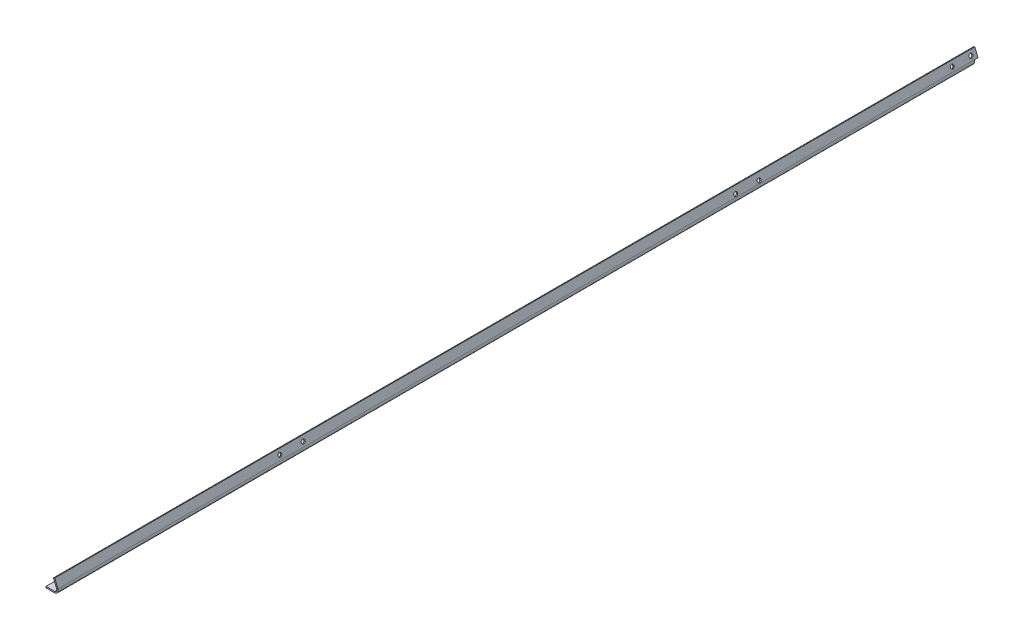
ISO-10303-21;
HEADER;
FILE_DESCRIPTION(('STEP AP214'),'2;1');
FILE_NAME('part.step','',(''),(''),'','','');
FILE_SCHEMA(('AUTOMOTIVE_DESIGN { 1 0 10303 214 1 1 1 1 }'));
ENDSEC;
DATA;
#1=APPLICATION_CONTEXT('core data for automotive mechanical design processes');
#2=APPLICATION_PROTOCOL_DEFINITION('international standard','automotive_design',2000,#1);
#3=PRODUCT_CONTEXT('',#1,'mechanical');
#4=PRODUCT('Part','Part','',(#3));
#5=PRODUCT_RELATED_PRODUCT_CATEGORY('part','',(#4));
#6=PRODUCT_DEFINITION_FORMATION('','',#4);
#7=PRODUCT_DEFINITION_CONTEXT('part definition',#1,'design');
#8=PRODUCT_DEFINITION('design','',#6,#7);
#9=PRODUCT_DEFINITION_SHAPE('','',#8);
#10=(LENGTH_UNIT() NAMED_UNIT(*) SI_UNIT(.MILLI.,.METRE.));
#11=(NAMED_UNIT(*) PLANE_ANGLE_UNIT() SI_UNIT($,.RADIAN.));
#12=(NAMED_UNIT(*) SI_UNIT($,.STERADIAN.) SOLID_ANGLE_UNIT());
#13=UNCERTAINTY_MEASURE_WITH_UNIT(LENGTH_MEASURE(1.E-05),#10,'distance_accuracy_value','');
#14=(GEOMETRIC_REPRESENTATION_CONTEXT(3) GLOBAL_UNCERTAINTY_ASSIGNED_CONTEXT((#13)) GLOBAL_UNIT_ASSIGNED_CONTEXT((#10,
#11,#12)) REPRESENTATION_CONTEXT('',''));
#15=CARTESIAN_POINT('',(0.,0.,0.));
#16=DIRECTION('',(0.,0.,1.));
#17=DIRECTION('',(1.,0.,0.));
#18=AXIS2_PLACEMENT_3D('',#15,#16,#17);
#19=CARTESIAN_POINT('',(-11.8604877481019,8.,-985.));
#20=DIRECTION('',(0.,0.,1.));
#21=DIRECTION('',(-1.,0.,0.));
#22=AXIS2_PLACEMENT_3D('',#19,#20,#21);
#23=CYLINDRICAL_SURFACE('',#22,5.);
#24=DIRECTION('',(0.,0.,1.));
#25=VECTOR('',#24,1.);
#26=CARTESIAN_POINT('',(-11.8604877481019,3.,-985.));
#27=LINE('',#26,#25);
#28=CARTESIAN_POINT('',(-11.8604877481019,3.,-977.));
#29=VERTEX_POINT('',#28);
#30=CARTESIAN_POINT('',(-11.8604877481019,3.,985.));
#31=VERTEX_POINT('',#30);
#32=EDGE_CURVE('E185',#29,#31,#27,.T.);
#33=ORIENTED_EDGE('',*,*,#32,.T.);
#34=CARTESIAN_POINT('',(-11.8604877481019,8.,985.));
#35=DIRECTION('',(0.,0.,1.));
#36=DIRECTION('',(1.,0.,0.));
#37=AXIS2_PLACEMENT_3D('',#34,#35,#36);
#38=CIRCLE('',#37,5.);
#39=CARTESIAN_POINT('',(-7.22456847526795,9.87303296707955,985.));
#40=VERTEX_POINT('',#39);
#41=EDGE_CURVE('E169',#31,#40,#38,.T.);
#42=ORIENTED_EDGE('',*,*,#41,.T.);
#43=DIRECTION('',(0.,0.,1.));
#44=VECTOR('',#43,1.);
#45=CARTESIAN_POINT('',(-7.22456847526795,9.87303296707955,-985.));
#46=LINE('',#45,#44);
#47=CARTESIAN_POINT('',(-7.22456847526795,9.87303296707955,-977.));
#48=VERTEX_POINT('',#47);
#49=EDGE_CURVE('E188',#48,#40,#46,.T.);
#50=ORIENTED_EDGE('',*,*,#49,.F.);
#51=CARTESIAN_POINT('',(-11.8604877481019,8.,-977.));
#52=DIRECTION('',(0.,0.,-1.));
#53=DIRECTION('',(-1.,0.,0.));
#54=AXIS2_PLACEMENT_3D('',#51,#52,#53);
#55=CIRCLE('',#54,5.);
#56=EDGE_CURVE('E136',#48,#29,#55,.T.);
#57=ORIENTED_EDGE('',*,*,#56,.T.);
#58=EDGE_LOOP('',(#33,#42,#50,#57));
#59=FACE_BOUND('',#58,.T.);
#60=ADVANCED_FACE('F37',(#59),#23,.F.);
#61=CARTESIAN_POINT('',(0.,3.,-985.));
#62=DIRECTION('',(0.,1.,0.));
#63=DIRECTION('',(-1.,0.,0.));
#64=AXIS2_PLACEMENT_3D('',#61,#62,#63);
#65=PLANE('',#64);
#66=DIRECTION('',(0.,0.,1.));
#67=VECTOR('',#66,1.);
#68=CARTESIAN_POINT('',(-30.,3.,-985.));
#69=LINE('',#68,#67);
#70=CARTESIAN_POINT('',(-30.,3.,-977.));
#71=VERTEX_POINT('',#70);
#72=CARTESIAN_POINT('',(-30.,3.,985.));
#73=VERTEX_POINT('',#72);
#74=EDGE_CURVE('E182',#71,#73,#69,.T.);
#75=ORIENTED_EDGE('',*,*,#74,.T.);
#76=DIRECTION('',(1.,0.,0.));
#77=VECTOR('',#76,1.);
#78=CARTESIAN_POINT('',(0.,3.,985.));
#79=LINE('',#78,#77);
#80=EDGE_CURVE('E172',#73,#31,#79,.T.);
#81=ORIENTED_EDGE('',*,*,#80,.T.);
#82=ORIENTED_EDGE('',*,*,#32,.F.);
#83=DIRECTION('',(-1.,0.,0.));
#84=VECTOR('',#83,1.);
#85=CARTESIAN_POINT('',(0.,3.,-977.));
#86=LINE('',#85,#84);
#87=EDGE_CURVE('E123',#29,#71,#86,.T.);
#88=ORIENTED_EDGE('',*,*,#87,.T.);
#89=EDGE_LOOP('',(#75,#81,#82,#88));
#90=FACE_BOUND('',#89,.T.);
#91=ADVANCED_FACE('F208',(#90),#65,.T.);
#92=CARTESIAN_POINT('',(-30.,0.,-985.));
#93=DIRECTION('',(-1.,0.,0.));
#94=DIRECTION('',(0.,0.,-1.));
#95=AXIS2_PLACEMENT_3D('',#92,#93,#94);
#96=PLANE('',#95);
#97=DIRECTION('',(0.,0.,1.));
#98=VECTOR('',#97,1.);
#99=CARTESIAN_POINT('',(-30.,0.,-985.));
#100=LINE('',#99,#98);
#101=CARTESIAN_POINT('',(-30.,0.,-977.));
#102=VERTEX_POINT('',#101);
#103=CARTESIAN_POINT('',(-30.,0.,985.));
#104=VERTEX_POINT('',#103);
#105=EDGE_CURVE('E144',#102,#104,#100,.T.);
#106=ORIENTED_EDGE('',*,*,#105,.T.);
#107=DIRECTION('',(0.,1.,0.));
#108=VECTOR('',#107,1.);
#109=CARTESIAN_POINT('',(-30.,0.,985.));
#110=LINE('',#109,#108);
#111=EDGE_CURVE('E175',#104,#73,#110,.T.);
#112=ORIENTED_EDGE('',*,*,#111,.T.);
#113=ORIENTED_EDGE('',*,*,#74,.F.);
#114=DIRECTION('',(0.,-1.,0.));
#115=VECTOR('',#114,1.);
#116=CARTESIAN_POINT('',(-30.,0.,-977.));
#117=LINE('',#116,#115);
#118=EDGE_CURVE('E127',#102,#71,#117,.F.);
#119=ORIENTED_EDGE('',*,*,#118,.F.);
#120=EDGE_LOOP('',(#106,#112,#113,#119));
#121=FACE_BOUND('',#120,.T.);
#122=ADVANCED_FACE('F215',(#121),#96,.T.);
#123=CARTESIAN_POINT('',(0.,0.,-985.));
#124=DIRECTION('',(0.,1.,0.));
#125=DIRECTION('',(-1.,0.,0.));
#126=AXIS2_PLACEMENT_3D('',#123,#124,#125);
#127=PLANE('',#126);
#128=DIRECTION('',(-1.,0.,0.));
#129=VECTOR('',#128,1.);
#130=CARTESIAN_POINT('',(-3.86048774810189,0.,-977.));
#131=LINE('',#130,#129);
#132=CARTESIAN_POINT('',(-11.8604877481019,0.,-977.));
#133=VERTEX_POINT('',#132);
#134=EDGE_CURVE('E120',#133,#102,#131,.T.);
#135=ORIENTED_EDGE('',*,*,#134,.F.);
#136=DIRECTION('',(0.,0.,1.));
#137=VECTOR('',#136,1.);
#138=CARTESIAN_POINT('',(-11.8604877481019,0.,-985.));
#139=LINE('',#138,#137);
#140=CARTESIAN_POINT('',(-11.8604877481019,0.,985.));
#141=VERTEX_POINT('',#140);
#142=EDGE_CURVE('E139',#133,#141,#139,.T.);
#143=ORIENTED_EDGE('',*,*,#142,.T.);
#144=DIRECTION('',(1.,0.,0.));
#145=VECTOR('',#144,1.);
#146=CARTESIAN_POINT('',(0.,0.,985.));
#147=LINE('',#146,#145);
#148=EDGE_CURVE('E177',#104,#141,#147,.T.);
#149=ORIENTED_EDGE('',*,*,#148,.F.);
#150=ORIENTED_EDGE('',*,*,#105,.F.);
#151=EDGE_LOOP('',(#135,#143,#149,#150));
#152=FACE_BOUND('',#151,.T.);
#153=ADVANCED_FACE('F148',(#152),#127,.F.);
#154=CARTESIAN_POINT('',(-11.8604877481019,8.,-985.));
#155=DIRECTION('',(0.,0.,1.));
#156=DIRECTION('',(-1.,0.,0.));
#157=AXIS2_PLACEMENT_3D('',#154,#155,#156);
#158=CYLINDRICAL_SURFACE('',#157,8.);
#159=CARTESIAN_POINT('',(-11.8604877481019,8.,-977.));
#160=DIRECTION('',(0.,0.,-1.));
#161=DIRECTION('',(-1.,0.,0.));
#162=AXIS2_PLACEMENT_3D('',#159,#160,#161);
#163=CIRCLE('',#162,8.);
#164=CARTESIAN_POINT('',(-4.44301691156759,10.9968527473273,-977.));
#165=VERTEX_POINT('',#164);
#166=EDGE_CURVE('E130',#165,#133,#163,.T.);
#167=ORIENTED_EDGE('',*,*,#166,.F.);
#168=DIRECTION('',(0.,0.,1.));
#169=VECTOR('',#168,1.);
#170=CARTESIAN_POINT('',(-4.44301691156759,10.9968527473273,-985.));
#171=LINE('',#170,#169);
#172=CARTESIAN_POINT('',(-4.44301691156759,10.9968527473273,985.));
#173=VERTEX_POINT('',#172);
#174=EDGE_CURVE('E161',#165,#173,#171,.T.);
#175=ORIENTED_EDGE('',*,*,#174,.T.);
#176=CARTESIAN_POINT('',(-11.8604877481019,8.,985.));
#177=DIRECTION('',(0.,0.,-1.));
#178=DIRECTION('',(-1.,0.,0.));
#179=AXIS2_PLACEMENT_3D('',#176,#177,#178);
#180=CIRCLE('',#179,8.);
#181=EDGE_CURVE('E141',#141,#173,#180,.F.);
#182=ORIENTED_EDGE('',*,*,#181,.F.);
#183=ORIENTED_EDGE('',*,*,#142,.F.);
#184=EDGE_LOOP('',(#167,#175,#182,#183));
#185=FACE_BOUND('',#184,.T.);
#186=ADVANCED_FACE('F140',(#185),#158,.T.);
#187=CARTESIAN_POINT('',(-4.44301691156759,10.9968527473273,985.));
#188=DIRECTION('',(0.,0.,1.));
#189=DIRECTION('',(-1.,0.,0.));
#190=AXIS2_PLACEMENT_3D('',#187,#188,#189);
#191=PLANE('',#190);
#192=DIRECTION('',(-0.927183854566789,-0.374606593415909,0.));
#193=VECTOR('',#192,1.);
#194=CARTESIAN_POINT('',(-4.44301691156759,10.9968527473273,985.));
#195=LINE('',#194,#193);
#196=EDGE_CURVE('E46',#173,#40,#195,.T.);
#197=ORIENTED_EDGE('',*,*,#196,.T.);
#198=ORIENTED_EDGE('',*,*,#41,.F.);
#199=DIRECTION('',(0.,-1.,0.));
#200=VECTOR('',#199,1.);
#201=CARTESIAN_POINT('',(-11.8604877481019,3.,985.));
#202=LINE('',#201,#200);
#203=EDGE_CURVE('E82',#31,#141,#202,.T.);
#204=ORIENTED_EDGE('',*,*,#203,.T.);
#205=ORIENTED_EDGE('',*,*,#181,.T.);
#206=EDGE_LOOP('',(#197,#198,#204,#205));
#207=FACE_BOUND('',#206,.T.);
#208=ADVANCED_FACE('F39',(#207),#191,.T.);
#209=CARTESIAN_POINT('',(-11.8604877481019,3.,985.));
#210=DIRECTION('',(0.,0.,1.));
#211=DIRECTION('',(-1.,0.,0.));
#212=AXIS2_PLACEMENT_3D('',#209,#210,#211);
#213=PLANE('',#212);
#214=DIRECTION('',(-0.37460659341591,0.927183854566788,0.));
#215=VECTOR('',#214,1.);
#216=CARTESIAN_POINT('',(0.,0.,985.));
#217=LINE('',#216,#215);
#218=CARTESIAN_POINT('',(-11.2381978024773,27.8155156370036,985.));
#219=VERTEX_POINT('',#218);
#220=EDGE_CURVE('E88',#173,#219,#217,.T.);
#221=ORIENTED_EDGE('',*,*,#220,.T.);
#222=DIRECTION('',(0.927183854566789,0.374606593415908,0.));
#223=VECTOR('',#222,1.);
#224=CARTESIAN_POINT('',(-14.0197493661777,26.6916958567559,985.));
#225=LINE('',#224,#223);
#226=CARTESIAN_POINT('',(-14.0197493661777,26.6916958567559,985.));
#227=VERTEX_POINT('',#226);
#228=EDGE_CURVE('E163',#227,#219,#225,.T.);
#229=ORIENTED_EDGE('',*,*,#228,.F.);
#230=DIRECTION('',(-0.37460659341591,0.927183854566788,0.));
#231=VECTOR('',#230,1.);
#232=CARTESIAN_POINT('',(-2.78155156370036,-1.12381978024773,985.));
#233=LINE('',#232,#231);
#234=EDGE_CURVE('E166',#40,#227,#233,.T.);
#235=ORIENTED_EDGE('',*,*,#234,.F.);
#236=ORIENTED_EDGE('',*,*,#196,.F.);
#237=EDGE_LOOP('',(#221,#229,#235,#236));
#238=FACE_BOUND('',#237,.T.);
#239=ADVANCED_FACE('F239',(#238),#213,.T.);
#240=CARTESIAN_POINT('',(0.,0.,-985.));
#241=DIRECTION('',(-0.927183854566788,-0.37460659341591,0.));
#242=DIRECTION('',(0.37460659341591,-0.927183854566788,0.));
#243=AXIS2_PLACEMENT_3D('',#240,#241,#242);
#244=PLANE('',#243);
#245=CARTESIAN_POINT('',(-6.36831208807047,15.7621255276354,-468.154266118861));
#246=DIRECTION('',(0.927183854566788,0.37460659341591,0.));
#247=DIRECTION('',(0.37460659341591,-0.927183854566788,0.));
#248=AXIS2_PLACEMENT_3D('',#245,#246,#247);
#249=CIRCLE('',#248,3.99999999999713);
#250=CARTESIAN_POINT('',(-4.86988571440791,12.0533901093709,-468.154266118861));
#251=VERTEX_POINT('',#250);
#252=EDGE_CURVE('E399',#251,#251,#249,.T.);
#253=ORIENTED_EDGE('',*,*,#252,.F.);
#254=EDGE_LOOP('',(#253));
#255=FACE_BOUND('',#254,.T.);
#256=CARTESIAN_POINT('',(-7.61410676221657,18.8455755476705,506.845733881157));
#257=DIRECTION('',(0.927183854566788,0.37460659341591,0.));
#258=DIRECTION('',(0.37460659341591,-0.927183854566788,0.));
#259=AXIS2_PLACEMENT_3D('',#256,#257,#258);
#260=CIRCLE('',#259,3.99999999999999);
#261=CARTESIAN_POINT('',(-6.11568038855293,15.1368401294033,506.845733881157));
#262=VERTEX_POINT('',#261);
#263=EDGE_CURVE('E403',#262,#262,#260,.T.);
#264=ORIENTED_EDGE('',*,*,#263,.F.);
#265=EDGE_LOOP('',(#264));
#266=FACE_BOUND('',#265,.T.);
#267=CARTESIAN_POINT('',(-7.61410676221657,18.8455755476705,456.845733881157));
#268=DIRECTION('',(0.927183854566788,0.37460659341591,0.));
#269=DIRECTION('',(0.37460659341591,-0.927183854566788,0.));
#270=AXIS2_PLACEMENT_3D('',#267,#268,#269);
#271=CIRCLE('',#270,3.99999999999999);
#272=CARTESIAN_POINT('',(-6.11568038855293,15.1368401294033,456.845733881157));
#273=VERTEX_POINT('',#272);
#274=EDGE_CURVE('E412',#273,#273,#271,.T.);
#275=ORIENTED_EDGE('',*,*,#274,.F.);
#276=EDGE_LOOP('',(#275));
#277=FACE_BOUND('',#276,.T.);
#278=CARTESIAN_POINT('',(-6.36831208807046,15.7621255276354,-518.154266118861));
#279=DIRECTION('',(0.927183854566788,0.37460659341591,0.));
#280=DIRECTION('',(0.37460659341591,-0.927183854566788,0.));
#281=AXIS2_PLACEMENT_3D('',#278,#279,#280);
#282=CIRCLE('',#281,3.99999999999713);
#283=CARTESIAN_POINT('',(-4.8698857144079,12.0533901093709,-518.154266118861));
#284=VERTEX_POINT('',#283);
#285=EDGE_CURVE('E418',#284,#284,#282,.T.);
#286=ORIENTED_EDGE('',*,*,#285,.F.);
#287=EDGE_LOOP('',(#286));
#288=FACE_BOUND('',#287,.T.);
#289=CARTESIAN_POINT('',(-7.61410676221543,18.8455755476677,-933.000000000009));
#290=DIRECTION('',(0.927183854566788,0.37460659341591,0.));
#291=DIRECTION('',(0.37460659341591,-0.927183854566788,0.));
#292=AXIS2_PLACEMENT_3D('',#289,#290,#291);
#293=CIRCLE('',#292,3.99999999999988);
#294=CARTESIAN_POINT('',(-6.11568038855184,15.1368401294006,-933.000000000009));
#295=VERTEX_POINT('',#294);
#296=EDGE_CURVE('E424',#295,#295,#293,.T.);
#297=ORIENTED_EDGE('',*,*,#296,.F.);
#298=EDGE_LOOP('',(#297));
#299=FACE_BOUND('',#298,.T.);
#300=CARTESIAN_POINT('',(-7.61410676221543,18.8455755476677,-973.000000000009));
#301=DIRECTION('',(0.927183854566788,0.37460659341591,0.));
#302=DIRECTION('',(0.37460659341591,-0.927183854566788,0.));
#303=AXIS2_PLACEMENT_3D('',#300,#301,#302);
#304=CIRCLE('',#303,4.0000000000051);
#305=CARTESIAN_POINT('',(-6.11568038854988,15.1368401293958,-973.000000000009));
#306=VERTEX_POINT('',#305);
#307=EDGE_CURVE('E430',#306,#306,#304,.T.);
#308=ORIENTED_EDGE('',*,*,#307,.F.);
#309=EDGE_LOOP('',(#308));
#310=FACE_BOUND('',#309,.T.);
#311=ORIENTED_EDGE('',*,*,#220,.F.);
#312=ORIENTED_EDGE('',*,*,#174,.F.);
#313=CARTESIAN_POINT('',(-4.44301691156759,10.9968527473273,-985.));
#314=VERTEX_POINT('',#313);
#315=EDGE_CURVE('E145',#314,#165,#171,.T.);
#316=ORIENTED_EDGE('',*,*,#315,.F.);
#317=DIRECTION('',(-0.37460659341591,0.927183854566788,0.));
#318=VECTOR('',#317,1.);
#319=CARTESIAN_POINT('',(0.,0.,-985.));
#320=LINE('',#319,#318);
#321=CARTESIAN_POINT('',(-11.2381978024773,27.8155156370036,-985.));
#322=VERTEX_POINT('',#321);
#323=EDGE_CURVE('E155',#314,#322,#320,.T.);
#324=ORIENTED_EDGE('',*,*,#323,.T.);
#325=DIRECTION('',(0.,0.,1.));
#326=VECTOR('',#325,1.);
#327=CARTESIAN_POINT('',(-11.2381978024773,27.8155156370036,-985.));
#328=LINE('',#327,#326);
#329=EDGE_CURVE('E194',#322,#219,#328,.T.);
#330=ORIENTED_EDGE('',*,*,#329,.T.);
#331=EDGE_LOOP('',(#311,#312,#316,#324,#330));
#332=FACE_BOUND('',#331,.T.);
#333=ADVANCED_FACE('F236',(#255,#266,#277,#288,#299,#310,#332),#244,.F.);
#334=CARTESIAN_POINT('',(-14.0197493661777,26.6916958567559,-985.));
#335=DIRECTION('',(-0.374606593415908,0.927183854566789,0.));
#336=DIRECTION('',(-0.927183854566789,-0.374606593415908,0.));
#337=AXIS2_PLACEMENT_3D('',#334,#335,#336);
#338=PLANE('',#337);
#339=ORIENTED_EDGE('',*,*,#228,.T.);
#340=ORIENTED_EDGE('',*,*,#329,.F.);
#341=DIRECTION('',(0.927183854566789,0.374606593415908,0.));
#342=VECTOR('',#341,1.);
#343=CARTESIAN_POINT('',(-14.0197493661777,26.6916958567559,-985.));
#344=LINE('',#343,#342);
#345=CARTESIAN_POINT('',(-14.0197493661777,26.6916958567559,-985.));
#346=VERTEX_POINT('',#345);
#347=EDGE_CURVE('E93',#346,#322,#344,.T.);
#348=ORIENTED_EDGE('',*,*,#347,.F.);
#349=DIRECTION('',(0.,0.,1.));
#350=VECTOR('',#349,1.);
#351=CARTESIAN_POINT('',(-14.0197493661777,26.6916958567559,-985.));
#352=LINE('',#351,#350);
#353=EDGE_CURVE('E192',#346,#227,#352,.T.);
#354=ORIENTED_EDGE('',*,*,#353,.T.);
#355=EDGE_LOOP('',(#339,#340,#348,#354));
#356=FACE_BOUND('',#355,.T.);
#357=ADVANCED_FACE('F232',(#356),#338,.T.);
#358=CARTESIAN_POINT('',(-2.78155156370036,-1.12381978024773,-985.));
#359=DIRECTION('',(-0.927183854566788,-0.37460659341591,0.));
#360=DIRECTION('',(0.37460659341591,-0.927183854566788,0.));
#361=AXIS2_PLACEMENT_3D('',#358,#359,#360);
#362=PLANE('',#361);
#363=CARTESIAN_POINT('',(-9.14986365177084,14.6383057473877,-468.154266118861));
#364=DIRECTION('',(0.927183854566788,0.37460659341591,0.));
#365=DIRECTION('',(0.37460659341591,-0.927183854566788,0.));
#366=AXIS2_PLACEMENT_3D('',#363,#364,#365);
#367=CIRCLE('',#366,3.99999999999713);
#368=CARTESIAN_POINT('',(-7.65143727810828,10.9295703291232,-468.154266118861));
#369=VERTEX_POINT('',#368);
#370=EDGE_CURVE('E396',#369,#369,#367,.T.);
#371=ORIENTED_EDGE('',*,*,#370,.T.);
#372=EDGE_LOOP('',(#371));
#373=FACE_BOUND('',#372,.T.);
#374=CARTESIAN_POINT('',(-10.3956583259169,17.7217557674227,506.845733881157));
#375=DIRECTION('',(0.927183854566788,0.37460659341591,0.));
#376=DIRECTION('',(0.37460659341591,-0.927183854566788,0.));
#377=AXIS2_PLACEMENT_3D('',#374,#375,#376);
#378=CIRCLE('',#377,3.99999999999999);
#379=CARTESIAN_POINT('',(-8.8972319522533,14.0130203491556,506.845733881157));
#380=VERTEX_POINT('',#379);
#381=EDGE_CURVE('E400',#380,#380,#378,.T.);
#382=ORIENTED_EDGE('',*,*,#381,.T.);
#383=EDGE_LOOP('',(#382));
#384=FACE_BOUND('',#383,.T.);
#385=CARTESIAN_POINT('',(-10.3956583259169,17.7217557674227,456.845733881157));
#386=DIRECTION('',(0.927183854566788,0.37460659341591,0.));
#387=DIRECTION('',(0.37460659341591,-0.927183854566788,0.));
#388=AXIS2_PLACEMENT_3D('',#385,#386,#387);
#389=CIRCLE('',#388,3.99999999999999);
#390=CARTESIAN_POINT('',(-8.8972319522533,14.0130203491556,456.845733881157));
#391=VERTEX_POINT('',#390);
#392=EDGE_CURVE('E409',#391,#391,#389,.T.);
#393=ORIENTED_EDGE('',*,*,#392,.T.);
#394=EDGE_LOOP('',(#393));
#395=FACE_BOUND('',#394,.T.);
#396=CARTESIAN_POINT('',(-9.14986365177083,14.6383057473877,-518.154266118861));
#397=DIRECTION('',(0.927183854566788,0.37460659341591,0.));
#398=DIRECTION('',(0.37460659341591,-0.927183854566788,0.));
#399=AXIS2_PLACEMENT_3D('',#396,#397,#398);
#400=CIRCLE('',#399,3.99999999999713);
#401=CARTESIAN_POINT('',(-7.65143727810826,10.9295703291232,-518.154266118861));
#402=VERTEX_POINT('',#401);
#403=EDGE_CURVE('E415',#402,#402,#400,.T.);
#404=ORIENTED_EDGE('',*,*,#403,.T.);
#405=EDGE_LOOP('',(#404));
#406=FACE_BOUND('',#405,.T.);
#407=CARTESIAN_POINT('',(-10.3956583259158,17.7217557674199,-933.000000000009));
#408=DIRECTION('',(0.927183854566788,0.37460659341591,0.));
#409=DIRECTION('',(0.37460659341591,-0.927183854566788,0.));
#410=AXIS2_PLACEMENT_3D('',#407,#408,#409);
#411=CIRCLE('',#410,3.99999999999988);
#412=CARTESIAN_POINT('',(-8.8972319522522,14.0130203491529,-933.000000000009));
#413=VERTEX_POINT('',#412);
#414=EDGE_CURVE('E421',#413,#413,#411,.T.);
#415=ORIENTED_EDGE('',*,*,#414,.T.);
#416=EDGE_LOOP('',(#415));
#417=FACE_BOUND('',#416,.T.);
#418=CARTESIAN_POINT('',(-10.3956583259158,17.7217557674199,-973.000000000009));
#419=DIRECTION('',(0.927183854566788,0.37460659341591,0.));
#420=DIRECTION('',(0.37460659341591,-0.927183854566788,0.));
#421=AXIS2_PLACEMENT_3D('',#418,#419,#420);
#422=CIRCLE('',#421,4.0000000000051);
#423=CARTESIAN_POINT('',(-8.89723195225025,14.013020349148,-973.000000000009));
#424=VERTEX_POINT('',#423);
#425=EDGE_CURVE('E427',#424,#424,#422,.T.);
#426=ORIENTED_EDGE('',*,*,#425,.T.);
#427=EDGE_LOOP('',(#426));
#428=FACE_BOUND('',#427,.T.);
#429=ORIENTED_EDGE('',*,*,#234,.T.);
#430=ORIENTED_EDGE('',*,*,#353,.F.);
#431=DIRECTION('',(-0.37460659341591,0.927183854566788,0.));
#432=VECTOR('',#431,1.);
#433=CARTESIAN_POINT('',(-2.78155156370036,-1.12381978024773,-985.));
#434=LINE('',#433,#432);
#435=CARTESIAN_POINT('',(-7.22456847526795,9.87303296707955,-985.));
#436=VERTEX_POINT('',#435);
#437=EDGE_CURVE('E159',#436,#346,#434,.T.);
#438=ORIENTED_EDGE('',*,*,#437,.F.);
#439=EDGE_CURVE('E189',#436,#48,#46,.T.);
#440=ORIENTED_EDGE('',*,*,#439,.T.);
#441=ORIENTED_EDGE('',*,*,#49,.T.);
#442=EDGE_LOOP('',(#429,#430,#438,#440,#441));
#443=FACE_BOUND('',#442,.T.);
#444=ADVANCED_FACE('F201',(#373,#384,#395,#406,#417,#428,#443),#362,.T.);
#445=CARTESIAN_POINT('',(-11.8604877481019,8.,-985.));
#446=DIRECTION('',(0.,0.,-1.));
#447=DIRECTION('',(1.,0.,0.));
#448=AXIS2_PLACEMENT_3D('',#445,#446,#447);
#449=PLANE('',#448);
#450=ORIENTED_EDGE('',*,*,#323,.F.);
#451=DIRECTION('',(0.927183854566789,0.374606593415909,0.));
#452=VECTOR('',#451,1.);
#453=CARTESIAN_POINT('',(-7.22456847526795,9.87303296707955,-985.));
#454=LINE('',#453,#452);
#455=EDGE_CURVE('E11',#436,#314,#454,.T.);
#456=ORIENTED_EDGE('',*,*,#455,.F.);
#457=ORIENTED_EDGE('',*,*,#437,.T.);
#458=ORIENTED_EDGE('',*,*,#347,.T.);
#459=EDGE_LOOP('',(#450,#456,#457,#458));
#460=FACE_BOUND('',#459,.T.);
#461=ADVANCED_FACE('F231',(#460),#449,.T.);
#462=CARTESIAN_POINT('',(-11.8604877481019,8.,985.));
#463=DIRECTION('',(0.,0.,-1.));
#464=DIRECTION('',(1.,0.,0.));
#465=AXIS2_PLACEMENT_3D('',#462,#463,#464);
#466=PLANE('',#465);
#467=ORIENTED_EDGE('',*,*,#80,.F.);
#468=ORIENTED_EDGE('',*,*,#111,.F.);
#469=ORIENTED_EDGE('',*,*,#148,.T.);
#470=ORIENTED_EDGE('',*,*,#203,.F.);
#471=EDGE_LOOP('',(#467,#468,#469,#470));
#472=FACE_BOUND('',#471,.T.);
#473=ADVANCED_FACE('F213',(#472),#466,.F.);
#474=CARTESIAN_POINT('',(-3.86048774810189,0.,-977.));
#475=DIRECTION('',(0.,0.,1.));
#476=DIRECTION('',(-1.,0.,0.));
#477=AXIS2_PLACEMENT_3D('',#474,#475,#476);
#478=PLANE('',#477);
#479=ORIENTED_EDGE('',*,*,#118,.T.);
#480=ORIENTED_EDGE('',*,*,#87,.F.);
#481=DIRECTION('',(0.,-1.,0.));
#482=VECTOR('',#481,1.);
#483=CARTESIAN_POINT('',(-11.8604877481019,0.,-977.));
#484=LINE('',#483,#482);
#485=EDGE_CURVE('E116',#133,#29,#484,.F.);
#486=ORIENTED_EDGE('',*,*,#485,.F.);
#487=ORIENTED_EDGE('',*,*,#134,.T.);
#488=EDGE_LOOP('',(#479,#480,#486,#487));
#489=FACE_BOUND('',#488,.T.);
#490=ADVANCED_FACE('F118',(#489),#478,.F.);
#491=CARTESIAN_POINT('',(-7.22456847526795,9.87303296707955,-981.));
#492=DIRECTION('',(0.374606593415911,-0.927183854566788,0.));
#493=DIRECTION('',(0.,0.,1.));
#494=AXIS2_PLACEMENT_3D('',#491,#492,#493);
#495=PLANE('',#494);
#496=ORIENTED_EDGE('',*,*,#455,.T.);
#497=ORIENTED_EDGE('',*,*,#315,.T.);
#498=DIRECTION('',(-0.927183854566788,-0.374606593415911,0.));
#499=VECTOR('',#498,1.);
#500=CARTESIAN_POINT('',(-7.22456847526795,9.87303296707955,-977.));
#501=LINE('',#500,#499);
#502=EDGE_CURVE('E133',#48,#165,#501,.F.);
#503=ORIENTED_EDGE('',*,*,#502,.F.);
#504=ORIENTED_EDGE('',*,*,#439,.F.);
#505=EDGE_LOOP('',(#496,#497,#503,#504));
#506=FACE_BOUND('',#505,.T.);
#507=ADVANCED_FACE('F246',(#506),#495,.T.);
#508=CARTESIAN_POINT('',(-11.8604877481019,8.,-977.));
#509=DIRECTION('',(0.,0.,-1.));
#510=DIRECTION('',(1.,0.,0.));
#511=AXIS2_PLACEMENT_3D('',#508,#509,#510);
#512=PLANE('',#511);
#513=ORIENTED_EDGE('',*,*,#485,.T.);
#514=ORIENTED_EDGE('',*,*,#56,.F.);
#515=ORIENTED_EDGE('',*,*,#502,.T.);
#516=ORIENTED_EDGE('',*,*,#166,.T.);
#517=EDGE_LOOP('',(#513,#514,#515,#516));
#518=FACE_BOUND('',#517,.T.);
#519=ADVANCED_FACE('F132',(#518),#512,.T.);
#520=CARTESIAN_POINT('',(-1.27171149629229,21.4080695697133,-973.000000000009));
#521=DIRECTION('',(-0.927183854566788,-0.37460659341591,0.));
#522=DIRECTION('',(0.37460659341591,-0.927183854566788,0.));
#523=AXIS2_PLACEMENT_3D('',#520,#521,#522);
#524=CYLINDRICAL_SURFACE('',#523,4.0000000000051);
#525=ORIENTED_EDGE('',*,*,#425,.F.);
#526=EDGE_LOOP('',(#525));
#527=FACE_BOUND('',#526,.T.);
#528=ORIENTED_EDGE('',*,*,#307,.T.);
#529=EDGE_LOOP('',(#528));
#530=FACE_BOUND('',#529,.T.);
#531=ADVANCED_FACE('F253',(#527,#530),#524,.F.);
#532=CARTESIAN_POINT('',(-1.27171149629229,21.4080695697133,-933.000000000009));
#533=DIRECTION('',(-0.927183854566788,-0.37460659341591,0.));
#534=DIRECTION('',(0.37460659341591,-0.927183854566788,0.));
#535=AXIS2_PLACEMENT_3D('',#532,#533,#534);
#536=CYLINDRICAL_SURFACE('',#535,3.99999999999988);
#537=ORIENTED_EDGE('',*,*,#414,.F.);
#538=EDGE_LOOP('',(#537));
#539=FACE_BOUND('',#538,.T.);
#540=ORIENTED_EDGE('',*,*,#296,.T.);
#541=EDGE_LOOP('',(#540));
#542=FACE_BOUND('',#541,.T.);
#543=ADVANCED_FACE('F341',(#539,#542),#536,.F.);
#544=CARTESIAN_POINT('',(-0.0259168221473181,18.3246195496811,-518.154266118861));
#545=DIRECTION('',(-0.927183854566788,-0.37460659341591,0.));
#546=DIRECTION('',(0.37460659341591,-0.927183854566788,0.));
#547=AXIS2_PLACEMENT_3D('',#544,#545,#546);
#548=CYLINDRICAL_SURFACE('',#547,3.99999999999713);
#549=ORIENTED_EDGE('',*,*,#403,.F.);
#550=EDGE_LOOP('',(#549));
#551=FACE_BOUND('',#550,.T.);
#552=ORIENTED_EDGE('',*,*,#285,.T.);
#553=EDGE_LOOP('',(#552));
#554=FACE_BOUND('',#553,.T.);
#555=ADVANCED_FACE('F350',(#551,#554),#548,.F.);
#556=CARTESIAN_POINT('',(-1.27171149629342,21.4080695697162,456.845733881157));
#557=DIRECTION('',(-0.927183854566788,-0.37460659341591,0.));
#558=DIRECTION('',(0.37460659341591,-0.927183854566788,0.));
#559=AXIS2_PLACEMENT_3D('',#556,#557,#558);
#560=CYLINDRICAL_SURFACE('',#559,3.99999999999999);
#561=ORIENTED_EDGE('',*,*,#392,.F.);
#562=EDGE_LOOP('',(#561));
#563=FACE_BOUND('',#562,.T.);
#564=ORIENTED_EDGE('',*,*,#274,.T.);
#565=EDGE_LOOP('',(#564));
#566=FACE_BOUND('',#565,.T.);
#567=ADVANCED_FACE('F359',(#563,#566),#560,.F.);
#568=CARTESIAN_POINT('',(-1.27171149629342,21.4080695697162,506.845733881157));
#569=DIRECTION('',(-0.927183854566788,-0.37460659341591,0.));
#570=DIRECTION('',(0.37460659341591,-0.927183854566788,0.));
#571=AXIS2_PLACEMENT_3D('',#568,#569,#570);
#572=CYLINDRICAL_SURFACE('',#571,3.99999999999999);
#573=ORIENTED_EDGE('',*,*,#381,.F.);
#574=EDGE_LOOP('',(#573));
#575=FACE_BOUND('',#574,.T.);
#576=ORIENTED_EDGE('',*,*,#263,.T.);
#577=EDGE_LOOP('',(#576));
#578=FACE_BOUND('',#577,.T.);
#579=ADVANCED_FACE('F369',(#575,#578),#572,.F.);
#580=CARTESIAN_POINT('',(-0.0259168221473285,18.3246195496811,-468.154266118861));
#581=DIRECTION('',(-0.927183854566788,-0.37460659341591,0.));
#582=DIRECTION('',(0.37460659341591,-0.927183854566788,0.));
#583=AXIS2_PLACEMENT_3D('',#580,#581,#582);
#584=CYLINDRICAL_SURFACE('',#583,3.99999999999713);
#585=ORIENTED_EDGE('',*,*,#370,.F.);
#586=EDGE_LOOP('',(#585));
#587=FACE_BOUND('',#586,.T.);
#588=ORIENTED_EDGE('',*,*,#252,.T.);
#589=EDGE_LOOP('',(#588));
#590=FACE_BOUND('',#589,.T.);
#591=ADVANCED_FACE('F379',(#587,#590),#584,.F.);
#592=CLOSED_SHELL('',(#60,#91,#122,#153,#186,#208,#239,#333,#357,#444,#461,#473,#490,#507,#519,
#531,#543,#555,#567,#579,#591));
#593=MANIFOLD_SOLID_BREP('B2',#592);
#594=ADVANCED_BREP_SHAPE_REPRESENTATION('',(#18,#593),#14);
#595=SHAPE_DEFINITION_REPRESENTATION(#9,#594);
ENDSEC;
END-ISO-10303-21;
